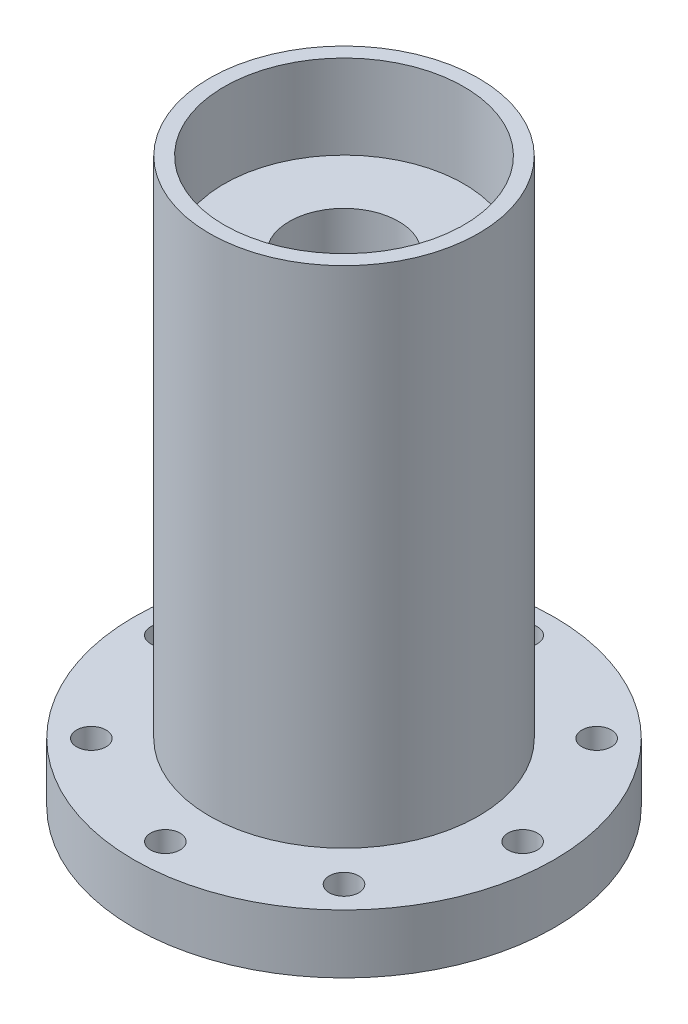
ISO-10303-21;
HEADER;
FILE_DESCRIPTION(('STEP AP214'),'2;1');
FILE_NAME('part.step','',(''),(''),'','','');
FILE_SCHEMA(('AUTOMOTIVE_DESIGN { 1 0 10303 214 1 1 1 1 }'));
ENDSEC;
DATA;
#1=APPLICATION_CONTEXT('core data for automotive mechanical design processes');
#2=APPLICATION_PROTOCOL_DEFINITION('international standard','automotive_design',2000,#1);
#3=PRODUCT_CONTEXT('',#1,'mechanical');
#4=PRODUCT('Part','Part','',(#3));
#5=PRODUCT_RELATED_PRODUCT_CATEGORY('part','',(#4));
#6=PRODUCT_DEFINITION_FORMATION('','',#4);
#7=PRODUCT_DEFINITION_CONTEXT('part definition',#1,'design');
#8=PRODUCT_DEFINITION('design','',#6,#7);
#9=PRODUCT_DEFINITION_SHAPE('','',#8);
#10=(LENGTH_UNIT() NAMED_UNIT(*) SI_UNIT(.MILLI.,.METRE.));
#11=(NAMED_UNIT(*) PLANE_ANGLE_UNIT() SI_UNIT($,.RADIAN.));
#12=(NAMED_UNIT(*) SI_UNIT($,.STERADIAN.) SOLID_ANGLE_UNIT());
#13=UNCERTAINTY_MEASURE_WITH_UNIT(LENGTH_MEASURE(1.E-05),#10,'distance_accuracy_value','');
#14=(GEOMETRIC_REPRESENTATION_CONTEXT(3) GLOBAL_UNCERTAINTY_ASSIGNED_CONTEXT((#13)) GLOBAL_UNIT_ASSIGNED_CONTEXT((#10,
#11,#12)) REPRESENTATION_CONTEXT('',''));
#15=CARTESIAN_POINT('',(0.,0.,0.));
#16=DIRECTION('',(0.,0.,1.));
#17=DIRECTION('',(1.,0.,0.));
#18=AXIS2_PLACEMENT_3D('',#15,#16,#17);
#19=CARTESIAN_POINT('',(0.,-48.0965675817327,14.25));
#20=DIRECTION('',(0.,1.,0.));
#21=DIRECTION('',(0.,0.,1.));
#22=AXIS2_PLACEMENT_3D('',#19,#20,#21);
#23=PLANE('',#22);
#24=CARTESIAN_POINT('',(0.,-48.0965675817327,0.));
#25=DIRECTION('',(0.,1.,0.));
#26=DIRECTION('',(0.,0.,1.));
#27=AXIS2_PLACEMENT_3D('',#24,#25,#26);
#28=CIRCLE('',#27,16.);
#29=CARTESIAN_POINT('',(0.,-48.0965675817327,16.));
#30=VERTEX_POINT('',#29);
#31=EDGE_CURVE('E10',#30,#30,#28,.T.);
#32=ORIENTED_EDGE('',*,*,#31,.T.);
#33=EDGE_LOOP('',(#32));
#34=FACE_BOUND('',#33,.T.);
#35=CARTESIAN_POINT('',(0.,-48.0965675817327,0.));
#36=DIRECTION('',(0.,1.,0.));
#37=DIRECTION('',(0.,0.,1.));
#38=AXIS2_PLACEMENT_3D('',#35,#36,#37);
#39=CIRCLE('',#38,14.25);
#40=CARTESIAN_POINT('',(0.,-48.0965675817327,14.25));
#41=VERTEX_POINT('',#40);
#42=EDGE_CURVE('E65',#41,#41,#39,.T.);
#43=ORIENTED_EDGE('',*,*,#42,.F.);
#44=EDGE_LOOP('',(#43));
#45=FACE_BOUND('',#44,.T.);
#46=ADVANCED_FACE('F31',(#34,#45),#23,.T.);
#47=CARTESIAN_POINT('',(0.,150.,0.));
#48=DIRECTION('',(0.,1.,0.));
#49=DIRECTION('',(0.,0.,1.));
#50=AXIS2_PLACEMENT_3D('',#47,#48,#49);
#51=CYLINDRICAL_SURFACE('',#50,16.);
#52=CARTESIAN_POINT('',(0.,-108.096567581733,0.));
#53=DIRECTION('',(0.,1.,0.));
#54=DIRECTION('',(0.,0.,1.));
#55=AXIS2_PLACEMENT_3D('',#52,#53,#54);
#56=CIRCLE('',#55,16.);
#57=CARTESIAN_POINT('',(0.,-108.096567581733,16.));
#58=VERTEX_POINT('',#57);
#59=EDGE_CURVE('E37',#58,#58,#56,.T.);
#60=ORIENTED_EDGE('',*,*,#59,.T.);
#61=EDGE_LOOP('',(#60));
#62=FACE_BOUND('',#61,.T.);
#63=ORIENTED_EDGE('',*,*,#31,.F.);
#64=EDGE_LOOP('',(#63));
#65=FACE_BOUND('',#64,.T.);
#66=ADVANCED_FACE('F140',(#62,#65),#51,.T.);
#67=CARTESIAN_POINT('',(0.,-108.096567581733,16.));
#68=DIRECTION('',(0.,1.,0.));
#69=DIRECTION('',(0.,0.,1.));
#70=AXIS2_PLACEMENT_3D('',#67,#68,#69);
#71=PLANE('',#70);
#72=CARTESIAN_POINT('',(15.0260191002145,-108.096567581733,-15.0260191002138));
#73=DIRECTION('',(0.,1.,0.));
#74=DIRECTION('',(0.,0.,1.));
#75=AXIS2_PLACEMENT_3D('',#72,#73,#74);
#76=CIRCLE('',#75,1.75);
#77=CARTESIAN_POINT('',(15.0260191002145,-108.096567581733,-13.2760191002138));
#78=VERTEX_POINT('',#77);
#79=EDGE_CURVE('E68',#78,#78,#76,.T.);
#80=ORIENTED_EDGE('',*,*,#79,.F.);
#81=EDGE_LOOP('',(#80));
#82=FACE_BOUND('',#81,.T.);
#83=CARTESIAN_POINT('',(0.,-108.096567581733,-21.25));
#84=DIRECTION('',(0.,1.,0.));
#85=DIRECTION('',(0.,0.,1.));
#86=AXIS2_PLACEMENT_3D('',#83,#84,#85);
#87=CIRCLE('',#86,1.75);
#88=CARTESIAN_POINT('',(0.,-108.096567581733,-19.5));
#89=VERTEX_POINT('',#88);
#90=EDGE_CURVE('E71',#89,#89,#87,.T.);
#91=ORIENTED_EDGE('',*,*,#90,.F.);
#92=EDGE_LOOP('',(#91));
#93=FACE_BOUND('',#92,.T.);
#94=CARTESIAN_POINT('',(-15.0260191002145,-108.096567581733,-15.0260191002138));
#95=DIRECTION('',(0.,1.,0.));
#96=DIRECTION('',(0.,0.,1.));
#97=AXIS2_PLACEMENT_3D('',#94,#95,#96);
#98=CIRCLE('',#97,1.75);
#99=CARTESIAN_POINT('',(-15.0260191002145,-108.096567581733,-13.2760191002138));
#100=VERTEX_POINT('',#99);
#101=EDGE_CURVE('E74',#100,#100,#98,.T.);
#102=ORIENTED_EDGE('',*,*,#101,.F.);
#103=EDGE_LOOP('',(#102));
#104=FACE_BOUND('',#103,.T.);
#105=CARTESIAN_POINT('',(21.25,-108.096567581733,0.));
#106=DIRECTION('',(0.,1.,0.));
#107=DIRECTION('',(0.,0.,1.));
#108=AXIS2_PLACEMENT_3D('',#105,#106,#107);
#109=CIRCLE('',#108,1.75);
#110=CARTESIAN_POINT('',(21.25,-108.096567581733,1.75));
#111=VERTEX_POINT('',#110);
#112=EDGE_CURVE('E77',#111,#111,#109,.T.);
#113=ORIENTED_EDGE('',*,*,#112,.F.);
#114=EDGE_LOOP('',(#113));
#115=FACE_BOUND('',#114,.T.);
#116=CARTESIAN_POINT('',(-21.25,-108.096567581733,0.));
#117=DIRECTION('',(0.,1.,0.));
#118=DIRECTION('',(0.,0.,1.));
#119=AXIS2_PLACEMENT_3D('',#116,#117,#118);
#120=CIRCLE('',#119,1.75);
#121=CARTESIAN_POINT('',(-21.25,-108.096567581733,1.75));
#122=VERTEX_POINT('',#121);
#123=EDGE_CURVE('E80',#122,#122,#120,.T.);
#124=ORIENTED_EDGE('',*,*,#123,.F.);
#125=EDGE_LOOP('',(#124));
#126=FACE_BOUND('',#125,.T.);
#127=CARTESIAN_POINT('',(15.0260191002142,-108.096567581733,15.0260191002141));
#128=DIRECTION('',(0.,1.,0.));
#129=DIRECTION('',(0.,0.,1.));
#130=AXIS2_PLACEMENT_3D('',#127,#128,#129);
#131=CIRCLE('',#130,1.75);
#132=CARTESIAN_POINT('',(15.0260191002142,-108.096567581733,16.7760191002141));
#133=VERTEX_POINT('',#132);
#134=EDGE_CURVE('E83',#133,#133,#131,.T.);
#135=ORIENTED_EDGE('',*,*,#134,.F.);
#136=EDGE_LOOP('',(#135));
#137=FACE_BOUND('',#136,.T.);
#138=CARTESIAN_POINT('',(0.,-108.096567581733,21.25));
#139=DIRECTION('',(0.,1.,0.));
#140=DIRECTION('',(0.,0.,1.));
#141=AXIS2_PLACEMENT_3D('',#138,#139,#140);
#142=CIRCLE('',#141,1.75);
#143=CARTESIAN_POINT('',(0.,-108.096567581733,23.));
#144=VERTEX_POINT('',#143);
#145=EDGE_CURVE('E86',#144,#144,#142,.T.);
#146=ORIENTED_EDGE('',*,*,#145,.F.);
#147=EDGE_LOOP('',(#146));
#148=FACE_BOUND('',#147,.T.);
#149=CARTESIAN_POINT('',(-15.0260191002142,-108.096567581733,15.0260191002141));
#150=DIRECTION('',(0.,1.,0.));
#151=DIRECTION('',(0.,0.,1.));
#152=AXIS2_PLACEMENT_3D('',#149,#150,#151);
#153=CIRCLE('',#152,1.75);
#154=CARTESIAN_POINT('',(-15.0260191002142,-108.096567581733,16.7760191002141));
#155=VERTEX_POINT('',#154);
#156=EDGE_CURVE('E89',#155,#155,#153,.T.);
#157=ORIENTED_EDGE('',*,*,#156,.F.);
#158=EDGE_LOOP('',(#157));
#159=FACE_BOUND('',#158,.T.);
#160=CARTESIAN_POINT('',(0.,-108.096567581733,0.));
#161=DIRECTION('',(0.,1.,0.));
#162=DIRECTION('',(0.,0.,1.));
#163=AXIS2_PLACEMENT_3D('',#160,#161,#162);
#164=CIRCLE('',#163,25.);
#165=CARTESIAN_POINT('',(0.,-108.096567581733,25.));
#166=VERTEX_POINT('',#165);
#167=EDGE_CURVE('E41',#166,#166,#164,.T.);
#168=ORIENTED_EDGE('',*,*,#167,.T.);
#169=EDGE_LOOP('',(#168));
#170=FACE_BOUND('',#169,.T.);
#171=ORIENTED_EDGE('',*,*,#59,.F.);
#172=EDGE_LOOP('',(#171));
#173=FACE_BOUND('',#172,.T.);
#174=ADVANCED_FACE('F134',(#82,#93,#104,#115,#126,#137,#148,#159,#170,#173),#71,.T.);
#175=CARTESIAN_POINT('',(0.,150.,0.));
#176=DIRECTION('',(0.,1.,0.));
#177=DIRECTION('',(0.,0.,1.));
#178=AXIS2_PLACEMENT_3D('',#175,#176,#177);
#179=CYLINDRICAL_SURFACE('',#178,25.);
#180=CARTESIAN_POINT('',(0.,-115.096567581733,0.));
#181=DIRECTION('',(0.,1.,0.));
#182=DIRECTION('',(0.,0.,1.));
#183=AXIS2_PLACEMENT_3D('',#180,#181,#182);
#184=CIRCLE('',#183,25.);
#185=CARTESIAN_POINT('',(0.,-115.096567581733,25.));
#186=VERTEX_POINT('',#185);
#187=EDGE_CURVE('E45',#186,#186,#184,.T.);
#188=ORIENTED_EDGE('',*,*,#187,.T.);
#189=EDGE_LOOP('',(#188));
#190=FACE_BOUND('',#189,.T.);
#191=ORIENTED_EDGE('',*,*,#167,.F.);
#192=EDGE_LOOP('',(#191));
#193=FACE_BOUND('',#192,.T.);
#194=ADVANCED_FACE('F123',(#190,#193),#179,.T.);
#195=CARTESIAN_POINT('',(0.,-115.096567581733,25.));
#196=DIRECTION('',(0.,-1.,0.));
#197=DIRECTION('',(0.,0.,-1.));
#198=AXIS2_PLACEMENT_3D('',#195,#196,#197);
#199=PLANE('',#198);
#200=CARTESIAN_POINT('',(15.0260191002145,-115.096567581733,-15.0260191002138));
#201=DIRECTION('',(0.,-1.,0.));
#202=DIRECTION('',(0.,0.,-1.));
#203=AXIS2_PLACEMENT_3D('',#200,#201,#202);
#204=CIRCLE('',#203,1.75);
#205=CARTESIAN_POINT('',(15.0260191002145,-115.096567581733,-16.7760191002138));
#206=VERTEX_POINT('',#205);
#207=EDGE_CURVE('E96',#206,#206,#204,.T.);
#208=ORIENTED_EDGE('',*,*,#207,.F.);
#209=EDGE_LOOP('',(#208));
#210=FACE_BOUND('',#209,.T.);
#211=CARTESIAN_POINT('',(0.,-115.096567581733,-21.25));
#212=DIRECTION('',(0.,-1.,0.));
#213=DIRECTION('',(0.,0.,-1.));
#214=AXIS2_PLACEMENT_3D('',#211,#212,#213);
#215=CIRCLE('',#214,1.75);
#216=CARTESIAN_POINT('',(0.,-115.096567581733,-23.));
#217=VERTEX_POINT('',#216);
#218=EDGE_CURVE('E99',#217,#217,#215,.T.);
#219=ORIENTED_EDGE('',*,*,#218,.F.);
#220=EDGE_LOOP('',(#219));
#221=FACE_BOUND('',#220,.T.);
#222=CARTESIAN_POINT('',(-15.0260191002145,-115.096567581733,-15.0260191002138));
#223=DIRECTION('',(0.,-1.,0.));
#224=DIRECTION('',(0.,0.,-1.));
#225=AXIS2_PLACEMENT_3D('',#222,#223,#224);
#226=CIRCLE('',#225,1.75);
#227=CARTESIAN_POINT('',(-15.0260191002145,-115.096567581733,-16.7760191002138));
#228=VERTEX_POINT('',#227);
#229=EDGE_CURVE('E102',#228,#228,#226,.T.);
#230=ORIENTED_EDGE('',*,*,#229,.F.);
#231=EDGE_LOOP('',(#230));
#232=FACE_BOUND('',#231,.T.);
#233=CARTESIAN_POINT('',(21.25,-115.096567581733,0.));
#234=DIRECTION('',(0.,-1.,0.));
#235=DIRECTION('',(0.,0.,-1.));
#236=AXIS2_PLACEMENT_3D('',#233,#234,#235);
#237=CIRCLE('',#236,1.75);
#238=CARTESIAN_POINT('',(21.25,-115.096567581733,-1.75));
#239=VERTEX_POINT('',#238);
#240=EDGE_CURVE('E105',#239,#239,#237,.T.);
#241=ORIENTED_EDGE('',*,*,#240,.F.);
#242=EDGE_LOOP('',(#241));
#243=FACE_BOUND('',#242,.T.);
#244=CARTESIAN_POINT('',(-21.25,-115.096567581733,0.));
#245=DIRECTION('',(0.,-1.,0.));
#246=DIRECTION('',(0.,0.,-1.));
#247=AXIS2_PLACEMENT_3D('',#244,#245,#246);
#248=CIRCLE('',#247,1.75);
#249=CARTESIAN_POINT('',(-21.25,-115.096567581733,-1.75));
#250=VERTEX_POINT('',#249);
#251=EDGE_CURVE('E108',#250,#250,#248,.T.);
#252=ORIENTED_EDGE('',*,*,#251,.F.);
#253=EDGE_LOOP('',(#252));
#254=FACE_BOUND('',#253,.T.);
#255=CARTESIAN_POINT('',(15.0260191002142,-115.096567581733,15.0260191002141));
#256=DIRECTION('',(0.,-1.,0.));
#257=DIRECTION('',(0.,0.,-1.));
#258=AXIS2_PLACEMENT_3D('',#255,#256,#257);
#259=CIRCLE('',#258,1.75);
#260=CARTESIAN_POINT('',(15.0260191002142,-115.096567581733,13.2760191002141));
#261=VERTEX_POINT('',#260);
#262=EDGE_CURVE('E111',#261,#261,#259,.T.);
#263=ORIENTED_EDGE('',*,*,#262,.F.);
#264=EDGE_LOOP('',(#263));
#265=FACE_BOUND('',#264,.T.);
#266=CARTESIAN_POINT('',(0.,-115.096567581733,21.25));
#267=DIRECTION('',(0.,-1.,0.));
#268=DIRECTION('',(0.,0.,-1.));
#269=AXIS2_PLACEMENT_3D('',#266,#267,#268);
#270=CIRCLE('',#269,1.75);
#271=CARTESIAN_POINT('',(0.,-115.096567581733,19.5));
#272=VERTEX_POINT('',#271);
#273=EDGE_CURVE('E95',#272,#272,#270,.T.);
#274=ORIENTED_EDGE('',*,*,#273,.F.);
#275=EDGE_LOOP('',(#274));
#276=FACE_BOUND('',#275,.T.);
#277=CARTESIAN_POINT('',(-15.0260191002142,-115.096567581733,15.0260191002141));
#278=DIRECTION('',(0.,-1.,0.));
#279=DIRECTION('',(0.,0.,-1.));
#280=AXIS2_PLACEMENT_3D('',#277,#278,#279);
#281=CIRCLE('',#280,1.75);
#282=CARTESIAN_POINT('',(-15.0260191002142,-115.096567581733,13.2760191002141));
#283=VERTEX_POINT('',#282);
#284=EDGE_CURVE('E92',#283,#283,#281,.T.);
#285=ORIENTED_EDGE('',*,*,#284,.F.);
#286=EDGE_LOOP('',(#285));
#287=FACE_BOUND('',#286,.T.);
#288=CARTESIAN_POINT('',(0.,-115.096567581733,0.));
#289=DIRECTION('',(0.,1.,0.));
#290=DIRECTION('',(0.,0.,1.));
#291=AXIS2_PLACEMENT_3D('',#288,#289,#290);
#292=CIRCLE('',#291,14.25);
#293=CARTESIAN_POINT('',(0.,-115.096567581733,14.25));
#294=VERTEX_POINT('',#293);
#295=EDGE_CURVE('E50',#294,#294,#292,.T.);
#296=ORIENTED_EDGE('',*,*,#295,.T.);
#297=EDGE_LOOP('',(#296));
#298=FACE_BOUND('',#297,.T.);
#299=ORIENTED_EDGE('',*,*,#187,.F.);
#300=EDGE_LOOP('',(#299));
#301=FACE_BOUND('',#300,.T.);
#302=ADVANCED_FACE('F119',(#210,#221,#232,#243,#254,#265,#276,#287,#298,#301),#199,.T.);
#303=CARTESIAN_POINT('',(0.,150.,0.));
#304=DIRECTION('',(0.,1.,0.));
#305=DIRECTION('',(0.,0.,1.));
#306=AXIS2_PLACEMENT_3D('',#303,#304,#305);
#307=CYLINDRICAL_SURFACE('',#306,14.25);
#308=CARTESIAN_POINT('',(0.,-105.096567581733,0.));
#309=DIRECTION('',(0.,1.,0.));
#310=DIRECTION('',(0.,0.,1.));
#311=AXIS2_PLACEMENT_3D('',#308,#309,#310);
#312=CIRCLE('',#311,14.25);
#313=CARTESIAN_POINT('',(0.,-105.096567581733,14.25));
#314=VERTEX_POINT('',#313);
#315=EDGE_CURVE('E53',#314,#314,#312,.T.);
#316=ORIENTED_EDGE('',*,*,#315,.T.);
#317=EDGE_LOOP('',(#316));
#318=FACE_BOUND('',#317,.T.);
#319=ORIENTED_EDGE('',*,*,#295,.F.);
#320=EDGE_LOOP('',(#319));
#321=FACE_BOUND('',#320,.T.);
#322=ADVANCED_FACE('F122',(#318,#321),#307,.F.);
#323=CARTESIAN_POINT('',(0.,-105.096567581733,14.25));
#324=DIRECTION('',(0.,-1.,0.));
#325=DIRECTION('',(0.,0.,-1.));
#326=AXIS2_PLACEMENT_3D('',#323,#324,#325);
#327=PLANE('',#326);
#328=CARTESIAN_POINT('',(0.,-105.096567581733,0.));
#329=DIRECTION('',(0.,1.,0.));
#330=DIRECTION('',(0.,0.,1.));
#331=AXIS2_PLACEMENT_3D('',#328,#329,#330);
#332=CIRCLE('',#331,6.49999999999997);
#333=CARTESIAN_POINT('',(0.,-105.096567581733,6.49999999999997));
#334=VERTEX_POINT('',#333);
#335=EDGE_CURVE('E56',#334,#334,#332,.T.);
#336=ORIENTED_EDGE('',*,*,#335,.T.);
#337=EDGE_LOOP('',(#336));
#338=FACE_BOUND('',#337,.T.);
#339=ORIENTED_EDGE('',*,*,#315,.F.);
#340=EDGE_LOOP('',(#339));
#341=FACE_BOUND('',#340,.T.);
#342=ADVANCED_FACE('F170',(#338,#341),#327,.T.);
#343=CARTESIAN_POINT('',(0.,150.,0.));
#344=DIRECTION('',(0.,1.,0.));
#345=DIRECTION('',(0.,0.,1.));
#346=AXIS2_PLACEMENT_3D('',#343,#344,#345);
#347=CYLINDRICAL_SURFACE('',#346,6.49999999999997);
#348=CARTESIAN_POINT('',(0.,-58.0965675817327,0.));
#349=DIRECTION('',(0.,1.,0.));
#350=DIRECTION('',(0.,0.,1.));
#351=AXIS2_PLACEMENT_3D('',#348,#349,#350);
#352=CIRCLE('',#351,6.49999999999997);
#353=CARTESIAN_POINT('',(0.,-58.0965675817327,6.49999999999997));
#354=VERTEX_POINT('',#353);
#355=EDGE_CURVE('E59',#354,#354,#352,.T.);
#356=ORIENTED_EDGE('',*,*,#355,.T.);
#357=EDGE_LOOP('',(#356));
#358=FACE_BOUND('',#357,.T.);
#359=ORIENTED_EDGE('',*,*,#335,.F.);
#360=EDGE_LOOP('',(#359));
#361=FACE_BOUND('',#360,.T.);
#362=ADVANCED_FACE('F164',(#358,#361),#347,.F.);
#363=CARTESIAN_POINT('',(0.,-58.0965675817327,14.25));
#364=DIRECTION('',(0.,1.,0.));
#365=DIRECTION('',(0.,0.,1.));
#366=AXIS2_PLACEMENT_3D('',#363,#364,#365);
#367=PLANE('',#366);
#368=CARTESIAN_POINT('',(0.,-58.0965675817327,0.));
#369=DIRECTION('',(0.,1.,0.));
#370=DIRECTION('',(0.,0.,1.));
#371=AXIS2_PLACEMENT_3D('',#368,#369,#370);
#372=CIRCLE('',#371,14.25);
#373=CARTESIAN_POINT('',(0.,-58.0965675817327,14.25));
#374=VERTEX_POINT('',#373);
#375=EDGE_CURVE('E62',#374,#374,#372,.T.);
#376=ORIENTED_EDGE('',*,*,#375,.T.);
#377=EDGE_LOOP('',(#376));
#378=FACE_BOUND('',#377,.T.);
#379=ORIENTED_EDGE('',*,*,#355,.F.);
#380=EDGE_LOOP('',(#379));
#381=FACE_BOUND('',#380,.T.);
#382=ADVANCED_FACE('F158',(#378,#381),#367,.T.);
#383=CARTESIAN_POINT('',(0.,150.,0.));
#384=DIRECTION('',(0.,1.,0.));
#385=DIRECTION('',(0.,0.,1.));
#386=AXIS2_PLACEMENT_3D('',#383,#384,#385);
#387=CYLINDRICAL_SURFACE('',#386,14.25);
#388=ORIENTED_EDGE('',*,*,#42,.T.);
#389=EDGE_LOOP('',(#388));
#390=FACE_BOUND('',#389,.T.);
#391=ORIENTED_EDGE('',*,*,#375,.F.);
#392=EDGE_LOOP('',(#391));
#393=FACE_BOUND('',#392,.T.);
#394=ADVANCED_FACE('F154',(#390,#393),#387,.F.);
#395=CARTESIAN_POINT('',(-15.0260191002142,-105.096567581733,15.0260191002141));
#396=DIRECTION('',(0.,-1.,0.));
#397=DIRECTION('',(0.,0.,-1.));
#398=AXIS2_PLACEMENT_3D('',#395,#396,#397);
#399=CYLINDRICAL_SURFACE('',#398,1.75);
#400=ORIENTED_EDGE('',*,*,#156,.T.);
#401=EDGE_LOOP('',(#400));
#402=FACE_BOUND('',#401,.T.);
#403=ORIENTED_EDGE('',*,*,#284,.T.);
#404=EDGE_LOOP('',(#403));
#405=FACE_BOUND('',#404,.T.);
#406=ADVANCED_FACE('F157',(#402,#405),#399,.F.);
#407=CARTESIAN_POINT('',(0.,-105.096567581733,21.25));
#408=DIRECTION('',(0.,-1.,0.));
#409=DIRECTION('',(0.,0.,-1.));
#410=AXIS2_PLACEMENT_3D('',#407,#408,#409);
#411=CYLINDRICAL_SURFACE('',#410,1.75);
#412=ORIENTED_EDGE('',*,*,#145,.T.);
#413=EDGE_LOOP('',(#412));
#414=FACE_BOUND('',#413,.T.);
#415=ORIENTED_EDGE('',*,*,#273,.T.);
#416=EDGE_LOOP('',(#415));
#417=FACE_BOUND('',#416,.T.);
#418=ADVANCED_FACE('F117',(#414,#417),#411,.F.);
#419=CARTESIAN_POINT('',(15.0260191002142,-105.096567581733,15.0260191002141));
#420=DIRECTION('',(0.,-1.,0.));
#421=DIRECTION('',(0.,0.,-1.));
#422=AXIS2_PLACEMENT_3D('',#419,#420,#421);
#423=CYLINDRICAL_SURFACE('',#422,1.75);
#424=ORIENTED_EDGE('',*,*,#134,.T.);
#425=EDGE_LOOP('',(#424));
#426=FACE_BOUND('',#425,.T.);
#427=ORIENTED_EDGE('',*,*,#262,.T.);
#428=EDGE_LOOP('',(#427));
#429=FACE_BOUND('',#428,.T.);
#430=ADVANCED_FACE('F207',(#426,#429),#423,.F.);
#431=CARTESIAN_POINT('',(-21.25,-105.096567581733,0.));
#432=DIRECTION('',(0.,-1.,0.));
#433=DIRECTION('',(0.,0.,-1.));
#434=AXIS2_PLACEMENT_3D('',#431,#432,#433);
#435=CYLINDRICAL_SURFACE('',#434,1.75);
#436=ORIENTED_EDGE('',*,*,#123,.T.);
#437=EDGE_LOOP('',(#436));
#438=FACE_BOUND('',#437,.T.);
#439=ORIENTED_EDGE('',*,*,#251,.T.);
#440=EDGE_LOOP('',(#439));
#441=FACE_BOUND('',#440,.T.);
#442=ADVANCED_FACE('F203',(#438,#441),#435,.F.);
#443=CARTESIAN_POINT('',(21.25,-105.096567581733,0.));
#444=DIRECTION('',(0.,-1.,0.));
#445=DIRECTION('',(0.,0.,-1.));
#446=AXIS2_PLACEMENT_3D('',#443,#444,#445);
#447=CYLINDRICAL_SURFACE('',#446,1.75);
#448=ORIENTED_EDGE('',*,*,#112,.T.);
#449=EDGE_LOOP('',(#448));
#450=FACE_BOUND('',#449,.T.);
#451=ORIENTED_EDGE('',*,*,#240,.T.);
#452=EDGE_LOOP('',(#451));
#453=FACE_BOUND('',#452,.T.);
#454=ADVANCED_FACE('F199',(#450,#453),#447,.F.);
#455=CARTESIAN_POINT('',(-15.0260191002145,-105.096567581733,-15.0260191002138));
#456=DIRECTION('',(0.,-1.,0.));
#457=DIRECTION('',(0.,0.,-1.));
#458=AXIS2_PLACEMENT_3D('',#455,#456,#457);
#459=CYLINDRICAL_SURFACE('',#458,1.75);
#460=ORIENTED_EDGE('',*,*,#101,.T.);
#461=EDGE_LOOP('',(#460));
#462=FACE_BOUND('',#461,.T.);
#463=ORIENTED_EDGE('',*,*,#229,.T.);
#464=EDGE_LOOP('',(#463));
#465=FACE_BOUND('',#464,.T.);
#466=ADVANCED_FACE('F195',(#462,#465),#459,.F.);
#467=CARTESIAN_POINT('',(0.,-105.096567581733,-21.25));
#468=DIRECTION('',(0.,-1.,0.));
#469=DIRECTION('',(0.,0.,-1.));
#470=AXIS2_PLACEMENT_3D('',#467,#468,#469);
#471=CYLINDRICAL_SURFACE('',#470,1.75);
#472=ORIENTED_EDGE('',*,*,#90,.T.);
#473=EDGE_LOOP('',(#472));
#474=FACE_BOUND('',#473,.T.);
#475=ORIENTED_EDGE('',*,*,#218,.T.);
#476=EDGE_LOOP('',(#475));
#477=FACE_BOUND('',#476,.T.);
#478=ADVANCED_FACE('F191',(#474,#477),#471,.F.);
#479=CARTESIAN_POINT('',(15.0260191002145,-105.096567581733,-15.0260191002138));
#480=DIRECTION('',(0.,-1.,0.));
#481=DIRECTION('',(0.,0.,-1.));
#482=AXIS2_PLACEMENT_3D('',#479,#480,#481);
#483=CYLINDRICAL_SURFACE('',#482,1.75);
#484=ORIENTED_EDGE('',*,*,#79,.T.);
#485=EDGE_LOOP('',(#484));
#486=FACE_BOUND('',#485,.T.);
#487=ORIENTED_EDGE('',*,*,#207,.T.);
#488=EDGE_LOOP('',(#487));
#489=FACE_BOUND('',#488,.T.);
#490=ADVANCED_FACE('F188',(#486,#489),#483,.F.);
#491=CLOSED_SHELL('',(#46,#66,#174,#194,#302,#322,#342,#362,#382,#394,#406,#418,#430,#442,#454,
#466,#478,#490));
#492=MANIFOLD_SOLID_BREP('B2',#491);
#493=ADVANCED_BREP_SHAPE_REPRESENTATION('',(#18,#492),#14);
#494=SHAPE_DEFINITION_REPRESENTATION(#9,#493);
ENDSEC;
END-ISO-10303-21;
